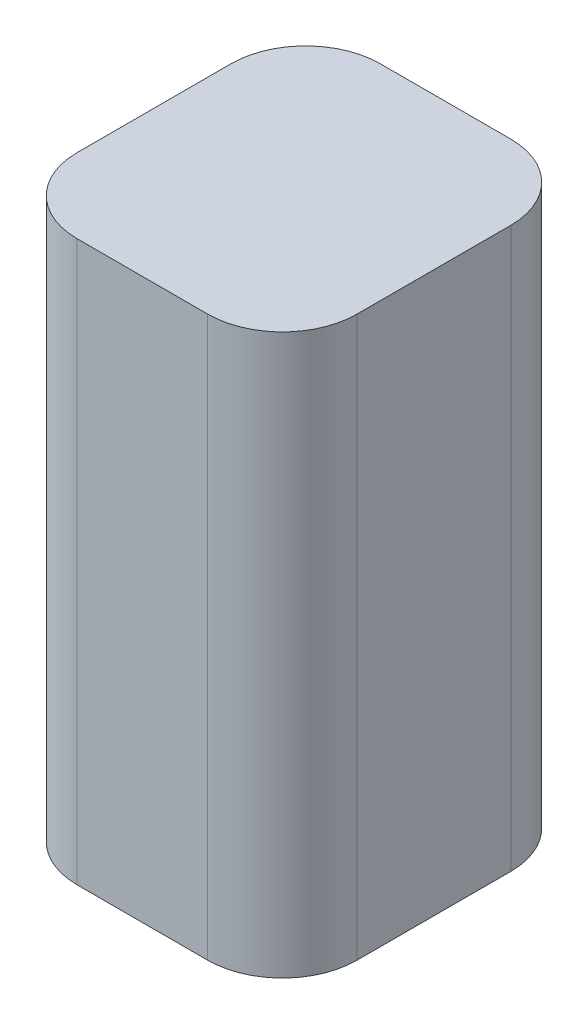
ISO-10303-21;
HEADER;
FILE_DESCRIPTION(('STEP AP214'),'2;1');
FILE_NAME('part.step','',(''),(''),'','','');
FILE_SCHEMA(('AUTOMOTIVE_DESIGN { 1 0 10303 214 1 1 1 1 }'));
ENDSEC;
DATA;
#1=APPLICATION_CONTEXT('core data for automotive mechanical design processes');
#2=APPLICATION_PROTOCOL_DEFINITION('international standard','automotive_design',2000,#1);
#3=PRODUCT_CONTEXT('',#1,'mechanical');
#4=PRODUCT('Part','Part','',(#3));
#5=PRODUCT_RELATED_PRODUCT_CATEGORY('part','',(#4));
#6=PRODUCT_DEFINITION_FORMATION('','',#4);
#7=PRODUCT_DEFINITION_CONTEXT('part definition',#1,'design');
#8=PRODUCT_DEFINITION('design','',#6,#7);
#9=PRODUCT_DEFINITION_SHAPE('','',#8);
#10=(LENGTH_UNIT() NAMED_UNIT(*) SI_UNIT(.MILLI.,.METRE.));
#11=(NAMED_UNIT(*) PLANE_ANGLE_UNIT() SI_UNIT($,.RADIAN.));
#12=(NAMED_UNIT(*) SI_UNIT($,.STERADIAN.) SOLID_ANGLE_UNIT());
#13=UNCERTAINTY_MEASURE_WITH_UNIT(LENGTH_MEASURE(1.E-05),#10,'distance_accuracy_value','');
#14=(GEOMETRIC_REPRESENTATION_CONTEXT(3) GLOBAL_UNCERTAINTY_ASSIGNED_CONTEXT((#13)) GLOBAL_UNIT_ASSIGNED_CONTEXT((#10,
#11,#12)) REPRESENTATION_CONTEXT('',''));
#15=CARTESIAN_POINT('',(0.,0.,0.));
#16=DIRECTION('',(0.,0.,1.));
#17=DIRECTION('',(1.,0.,0.));
#18=AXIS2_PLACEMENT_3D('',#15,#16,#17);
#19=CARTESIAN_POINT('',(-355.6,3048.,419.1));
#20=DIRECTION('',(0.,-1.,0.));
#21=DIRECTION('',(0.,0.,-1.));
#22=AXIS2_PLACEMENT_3D('',#19,#20,#21);
#23=CYLINDRICAL_SURFACE('',#22,406.4);
#24=CARTESIAN_POINT('',(-355.6,0.,419.1));
#25=DIRECTION('',(0.,1.,0.));
#26=DIRECTION('',(0.,0.,1.));
#27=AXIS2_PLACEMENT_3D('',#24,#25,#26);
#28=CIRCLE('',#27,406.4);
#29=CARTESIAN_POINT('',(-762.,0.,419.099999999997));
#30=VERTEX_POINT('',#29);
#31=CARTESIAN_POINT('',(-355.599999999997,0.,825.5));
#32=VERTEX_POINT('',#31);
#33=EDGE_CURVE('E129',#30,#32,#28,.T.);
#34=ORIENTED_EDGE('',*,*,#33,.T.);
#35=DIRECTION('',(0.,-1.,0.));
#36=VECTOR('',#35,1.);
#37=CARTESIAN_POINT('',(-355.599999999997,3048.,825.5));
#38=LINE('',#37,#36);
#39=CARTESIAN_POINT('',(-355.599999999997,3048.,825.5));
#40=VERTEX_POINT('',#39);
#41=EDGE_CURVE('E11',#40,#32,#38,.T.);
#42=ORIENTED_EDGE('',*,*,#41,.F.);
#43=CARTESIAN_POINT('',(-355.6,3048.,419.1));
#44=DIRECTION('',(0.,1.,0.));
#45=DIRECTION('',(0.,0.,1.));
#46=AXIS2_PLACEMENT_3D('',#43,#44,#45);
#47=CIRCLE('',#46,406.4);
#48=CARTESIAN_POINT('',(-762.,3048.,419.099999999997));
#49=VERTEX_POINT('',#48);
#50=EDGE_CURVE('E143',#49,#40,#47,.T.);
#51=ORIENTED_EDGE('',*,*,#50,.F.);
#52=DIRECTION('',(0.,-1.,0.));
#53=VECTOR('',#52,1.);
#54=CARTESIAN_POINT('',(-762.,3048.,419.099999999997));
#55=LINE('',#54,#53);
#56=EDGE_CURVE('E125',#49,#30,#55,.T.);
#57=ORIENTED_EDGE('',*,*,#56,.T.);
#58=EDGE_LOOP('',(#34,#42,#51,#57));
#59=FACE_BOUND('',#58,.T.);
#60=ADVANCED_FACE('F33',(#59),#23,.T.);
#61=CARTESIAN_POINT('',(-355.599999999997,3048.,825.5));
#62=DIRECTION('',(0.,0.,-1.));
#63=DIRECTION('',(-1.,0.,0.));
#64=AXIS2_PLACEMENT_3D('',#61,#62,#63);
#65=PLANE('',#64);
#66=DIRECTION('',(1.,0.,0.));
#67=VECTOR('',#66,1.);
#68=CARTESIAN_POINT('',(-355.599999999997,0.,825.5));
#69=LINE('',#68,#67);
#70=CARTESIAN_POINT('',(355.599999999997,0.,825.5));
#71=VERTEX_POINT('',#70);
#72=EDGE_CURVE('E132',#32,#71,#69,.T.);
#73=ORIENTED_EDGE('',*,*,#72,.T.);
#74=DIRECTION('',(0.,-1.,0.));
#75=VECTOR('',#74,1.);
#76=CARTESIAN_POINT('',(355.599999999997,3048.,825.5));
#77=LINE('',#76,#75);
#78=CARTESIAN_POINT('',(355.599999999997,3048.,825.5));
#79=VERTEX_POINT('',#78);
#80=EDGE_CURVE('E41',#79,#71,#77,.T.);
#81=ORIENTED_EDGE('',*,*,#80,.F.);
#82=DIRECTION('',(1.,0.,0.));
#83=VECTOR('',#82,1.);
#84=CARTESIAN_POINT('',(-355.599999999997,3048.,825.5));
#85=LINE('',#84,#83);
#86=EDGE_CURVE('E92',#40,#79,#85,.T.);
#87=ORIENTED_EDGE('',*,*,#86,.F.);
#88=ORIENTED_EDGE('',*,*,#41,.T.);
#89=EDGE_LOOP('',(#73,#81,#87,#88));
#90=FACE_BOUND('',#89,.T.);
#91=ADVANCED_FACE('F178',(#90),#65,.F.);
#92=CARTESIAN_POINT('',(355.6,3048.,419.1));
#93=DIRECTION('',(0.,-1.,0.));
#94=DIRECTION('',(0.,0.,-1.));
#95=AXIS2_PLACEMENT_3D('',#92,#93,#94);
#96=CYLINDRICAL_SURFACE('',#95,406.4);
#97=CARTESIAN_POINT('',(355.6,0.,419.1));
#98=DIRECTION('',(0.,1.,0.));
#99=DIRECTION('',(0.,0.,1.));
#100=AXIS2_PLACEMENT_3D('',#97,#98,#99);
#101=CIRCLE('',#100,406.4);
#102=CARTESIAN_POINT('',(762.,0.,419.099999999997));
#103=VERTEX_POINT('',#102);
#104=EDGE_CURVE('E134',#71,#103,#101,.T.);
#105=ORIENTED_EDGE('',*,*,#104,.T.);
#106=DIRECTION('',(0.,-1.,0.));
#107=VECTOR('',#106,1.);
#108=CARTESIAN_POINT('',(762.,3048.,419.099999999997));
#109=LINE('',#108,#107);
#110=CARTESIAN_POINT('',(762.,3048.,419.099999999997));
#111=VERTEX_POINT('',#110);
#112=EDGE_CURVE('E150',#111,#103,#109,.T.);
#113=ORIENTED_EDGE('',*,*,#112,.F.);
#114=CARTESIAN_POINT('',(355.6,3048.,419.1));
#115=DIRECTION('',(0.,1.,0.));
#116=DIRECTION('',(0.,0.,1.));
#117=AXIS2_PLACEMENT_3D('',#114,#115,#116);
#118=CIRCLE('',#117,406.4);
#119=EDGE_CURVE('E158',#79,#111,#118,.T.);
#120=ORIENTED_EDGE('',*,*,#119,.F.);
#121=ORIENTED_EDGE('',*,*,#80,.T.);
#122=EDGE_LOOP('',(#105,#113,#120,#121));
#123=FACE_BOUND('',#122,.T.);
#124=ADVANCED_FACE('F156',(#123),#96,.T.);
#125=CARTESIAN_POINT('',(762.,3048.,419.099999999997));
#126=DIRECTION('',(-1.,0.,0.));
#127=DIRECTION('',(0.,0.,1.));
#128=AXIS2_PLACEMENT_3D('',#125,#126,#127);
#129=PLANE('',#128);
#130=DIRECTION('',(0.,0.,-1.));
#131=VECTOR('',#130,1.);
#132=CARTESIAN_POINT('',(762.,0.,419.099999999997));
#133=LINE('',#132,#131);
#134=CARTESIAN_POINT('',(762.,0.,-419.099999999997));
#135=VERTEX_POINT('',#134);
#136=EDGE_CURVE('E136',#103,#135,#133,.T.);
#137=ORIENTED_EDGE('',*,*,#136,.T.);
#138=DIRECTION('',(0.,-1.,0.));
#139=VECTOR('',#138,1.);
#140=CARTESIAN_POINT('',(762.,3048.,-419.099999999997));
#141=LINE('',#140,#139);
#142=CARTESIAN_POINT('',(762.,3048.,-419.099999999997));
#143=VERTEX_POINT('',#142);
#144=EDGE_CURVE('E147',#143,#135,#141,.T.);
#145=ORIENTED_EDGE('',*,*,#144,.F.);
#146=DIRECTION('',(0.,0.,-1.));
#147=VECTOR('',#146,1.);
#148=CARTESIAN_POINT('',(762.,3048.,419.099999999997));
#149=LINE('',#148,#147);
#150=EDGE_CURVE('E170',#111,#143,#149,.T.);
#151=ORIENTED_EDGE('',*,*,#150,.F.);
#152=ORIENTED_EDGE('',*,*,#112,.T.);
#153=EDGE_LOOP('',(#137,#145,#151,#152));
#154=FACE_BOUND('',#153,.T.);
#155=ADVANCED_FACE('F166',(#154),#129,.F.);
#156=CARTESIAN_POINT('',(355.6,3048.,-419.1));
#157=DIRECTION('',(0.,-1.,0.));
#158=DIRECTION('',(0.,0.,-1.));
#159=AXIS2_PLACEMENT_3D('',#156,#157,#158);
#160=CYLINDRICAL_SURFACE('',#159,406.4);
#161=CARTESIAN_POINT('',(355.6,0.,-419.1));
#162=DIRECTION('',(0.,1.,0.));
#163=DIRECTION('',(0.,0.,1.));
#164=AXIS2_PLACEMENT_3D('',#161,#162,#163);
#165=CIRCLE('',#164,406.4);
#166=CARTESIAN_POINT('',(355.599999999997,0.,-825.5));
#167=VERTEX_POINT('',#166);
#168=EDGE_CURVE('E138',#135,#167,#165,.T.);
#169=ORIENTED_EDGE('',*,*,#168,.T.);
#170=DIRECTION('',(0.,-1.,0.));
#171=VECTOR('',#170,1.);
#172=CARTESIAN_POINT('',(355.599999999997,3048.,-825.5));
#173=LINE('',#172,#171);
#174=CARTESIAN_POINT('',(355.599999999997,3048.,-825.5));
#175=VERTEX_POINT('',#174);
#176=EDGE_CURVE('E120',#175,#167,#173,.T.);
#177=ORIENTED_EDGE('',*,*,#176,.F.);
#178=CARTESIAN_POINT('',(355.6,3048.,-419.1));
#179=DIRECTION('',(0.,1.,0.));
#180=DIRECTION('',(0.,0.,1.));
#181=AXIS2_PLACEMENT_3D('',#178,#179,#180);
#182=CIRCLE('',#181,406.4);
#183=EDGE_CURVE('E111',#143,#175,#182,.T.);
#184=ORIENTED_EDGE('',*,*,#183,.F.);
#185=ORIENTED_EDGE('',*,*,#144,.T.);
#186=EDGE_LOOP('',(#169,#177,#184,#185));
#187=FACE_BOUND('',#186,.T.);
#188=ADVANCED_FACE('F169',(#187),#160,.T.);
#189=CARTESIAN_POINT('',(-355.599999999997,3048.,-825.5));
#190=DIRECTION('',(0.,0.,1.));
#191=DIRECTION('',(1.,0.,0.));
#192=AXIS2_PLACEMENT_3D('',#189,#190,#191);
#193=PLANE('',#192);
#194=DIRECTION('',(-1.,0.,0.));
#195=VECTOR('',#194,1.);
#196=CARTESIAN_POINT('',(-355.599999999997,0.,-825.5));
#197=LINE('',#196,#195);
#198=CARTESIAN_POINT('',(-355.599999999997,0.,-825.5));
#199=VERTEX_POINT('',#198);
#200=EDGE_CURVE('E119',#167,#199,#197,.T.);
#201=ORIENTED_EDGE('',*,*,#200,.T.);
#202=DIRECTION('',(0.,-1.,0.));
#203=VECTOR('',#202,1.);
#204=CARTESIAN_POINT('',(-355.599999999997,3048.,-825.5));
#205=LINE('',#204,#203);
#206=CARTESIAN_POINT('',(-355.599999999997,3048.,-825.5));
#207=VERTEX_POINT('',#206);
#208=EDGE_CURVE('E116',#207,#199,#205,.T.);
#209=ORIENTED_EDGE('',*,*,#208,.F.);
#210=DIRECTION('',(-1.,0.,0.));
#211=VECTOR('',#210,1.);
#212=CARTESIAN_POINT('',(-355.599999999997,3048.,-825.5));
#213=LINE('',#212,#211);
#214=EDGE_CURVE('E105',#175,#207,#213,.T.);
#215=ORIENTED_EDGE('',*,*,#214,.F.);
#216=ORIENTED_EDGE('',*,*,#176,.T.);
#217=EDGE_LOOP('',(#201,#209,#215,#216));
#218=FACE_BOUND('',#217,.T.);
#219=ADVANCED_FACE('F117',(#218),#193,.F.);
#220=CARTESIAN_POINT('',(-355.6,3048.,-419.1));
#221=DIRECTION('',(0.,-1.,0.));
#222=DIRECTION('',(0.,0.,-1.));
#223=AXIS2_PLACEMENT_3D('',#220,#221,#222);
#224=CYLINDRICAL_SURFACE('',#223,406.4);
#225=CARTESIAN_POINT('',(-355.6,0.,-419.1));
#226=DIRECTION('',(0.,1.,0.));
#227=DIRECTION('',(0.,0.,1.));
#228=AXIS2_PLACEMENT_3D('',#225,#226,#227);
#229=CIRCLE('',#228,406.4);
#230=CARTESIAN_POINT('',(-762.,0.,-419.099999999997));
#231=VERTEX_POINT('',#230);
#232=EDGE_CURVE('E78',#199,#231,#229,.T.);
#233=ORIENTED_EDGE('',*,*,#232,.T.);
#234=DIRECTION('',(0.,-1.,0.));
#235=VECTOR('',#234,1.);
#236=CARTESIAN_POINT('',(-762.,3048.,-419.099999999997));
#237=LINE('',#236,#235);
#238=CARTESIAN_POINT('',(-762.,3048.,-419.099999999997));
#239=VERTEX_POINT('',#238);
#240=EDGE_CURVE('E121',#239,#231,#237,.T.);
#241=ORIENTED_EDGE('',*,*,#240,.F.);
#242=CARTESIAN_POINT('',(-355.6,3048.,-419.1));
#243=DIRECTION('',(0.,1.,0.));
#244=DIRECTION('',(0.,0.,1.));
#245=AXIS2_PLACEMENT_3D('',#242,#243,#244);
#246=CIRCLE('',#245,406.4);
#247=EDGE_CURVE('E109',#207,#239,#246,.T.);
#248=ORIENTED_EDGE('',*,*,#247,.F.);
#249=ORIENTED_EDGE('',*,*,#208,.T.);
#250=EDGE_LOOP('',(#233,#241,#248,#249));
#251=FACE_BOUND('',#250,.T.);
#252=ADVANCED_FACE('F123',(#251),#224,.T.);
#253=CARTESIAN_POINT('',(-762.,3048.,419.099999999997));
#254=DIRECTION('',(1.,0.,0.));
#255=DIRECTION('',(0.,0.,-1.));
#256=AXIS2_PLACEMENT_3D('',#253,#254,#255);
#257=PLANE('',#256);
#258=DIRECTION('',(0.,0.,1.));
#259=VECTOR('',#258,1.);
#260=CARTESIAN_POINT('',(-762.,0.,419.099999999997));
#261=LINE('',#260,#259);
#262=EDGE_CURVE('E84',#231,#30,#261,.T.);
#263=ORIENTED_EDGE('',*,*,#262,.T.);
#264=ORIENTED_EDGE('',*,*,#56,.F.);
#265=DIRECTION('',(0.,0.,1.));
#266=VECTOR('',#265,1.);
#267=CARTESIAN_POINT('',(-762.,3048.,419.099999999997));
#268=LINE('',#267,#266);
#269=EDGE_CURVE('E49',#239,#49,#268,.T.);
#270=ORIENTED_EDGE('',*,*,#269,.F.);
#271=ORIENTED_EDGE('',*,*,#240,.T.);
#272=EDGE_LOOP('',(#263,#264,#270,#271));
#273=FACE_BOUND('',#272,.T.);
#274=ADVANCED_FACE('F194',(#273),#257,.F.);
#275=CARTESIAN_POINT('',(-355.6,3048.,419.1));
#276=DIRECTION('',(0.,1.,0.));
#277=DIRECTION('',(0.,0.,1.));
#278=AXIS2_PLACEMENT_3D('',#275,#276,#277);
#279=PLANE('',#278);
#280=ORIENTED_EDGE('',*,*,#50,.T.);
#281=ORIENTED_EDGE('',*,*,#86,.T.);
#282=ORIENTED_EDGE('',*,*,#119,.T.);
#283=ORIENTED_EDGE('',*,*,#150,.T.);
#284=ORIENTED_EDGE('',*,*,#183,.T.);
#285=ORIENTED_EDGE('',*,*,#214,.T.);
#286=ORIENTED_EDGE('',*,*,#247,.T.);
#287=ORIENTED_EDGE('',*,*,#269,.T.);
#288=EDGE_LOOP('',(#280,#281,#282,#283,#284,#285,#286,#287));
#289=FACE_BOUND('',#288,.T.);
#290=ADVANCED_FACE('F107',(#289),#279,.T.);
#291=CARTESIAN_POINT('',(-355.6,0.,419.1));
#292=DIRECTION('',(0.,1.,0.));
#293=DIRECTION('',(0.,0.,1.));
#294=AXIS2_PLACEMENT_3D('',#291,#292,#293);
#295=PLANE('',#294);
#296=ORIENTED_EDGE('',*,*,#33,.F.);
#297=ORIENTED_EDGE('',*,*,#262,.F.);
#298=ORIENTED_EDGE('',*,*,#232,.F.);
#299=ORIENTED_EDGE('',*,*,#200,.F.);
#300=ORIENTED_EDGE('',*,*,#168,.F.);
#301=ORIENTED_EDGE('',*,*,#136,.F.);
#302=ORIENTED_EDGE('',*,*,#104,.F.);
#303=ORIENTED_EDGE('',*,*,#72,.F.);
#304=EDGE_LOOP('',(#296,#297,#298,#299,#300,#301,#302,#303));
#305=FACE_BOUND('',#304,.T.);
#306=ADVANCED_FACE('F162',(#305),#295,.F.);
#307=CLOSED_SHELL('',(#60,#91,#124,#155,#188,#219,#252,#274,#290,#306));
#308=MANIFOLD_SOLID_BREP('B2',#307);
#309=ADVANCED_BREP_SHAPE_REPRESENTATION('',(#18,#308),#14);
#310=SHAPE_DEFINITION_REPRESENTATION(#9,#309);
ENDSEC;
END-ISO-10303-21;
